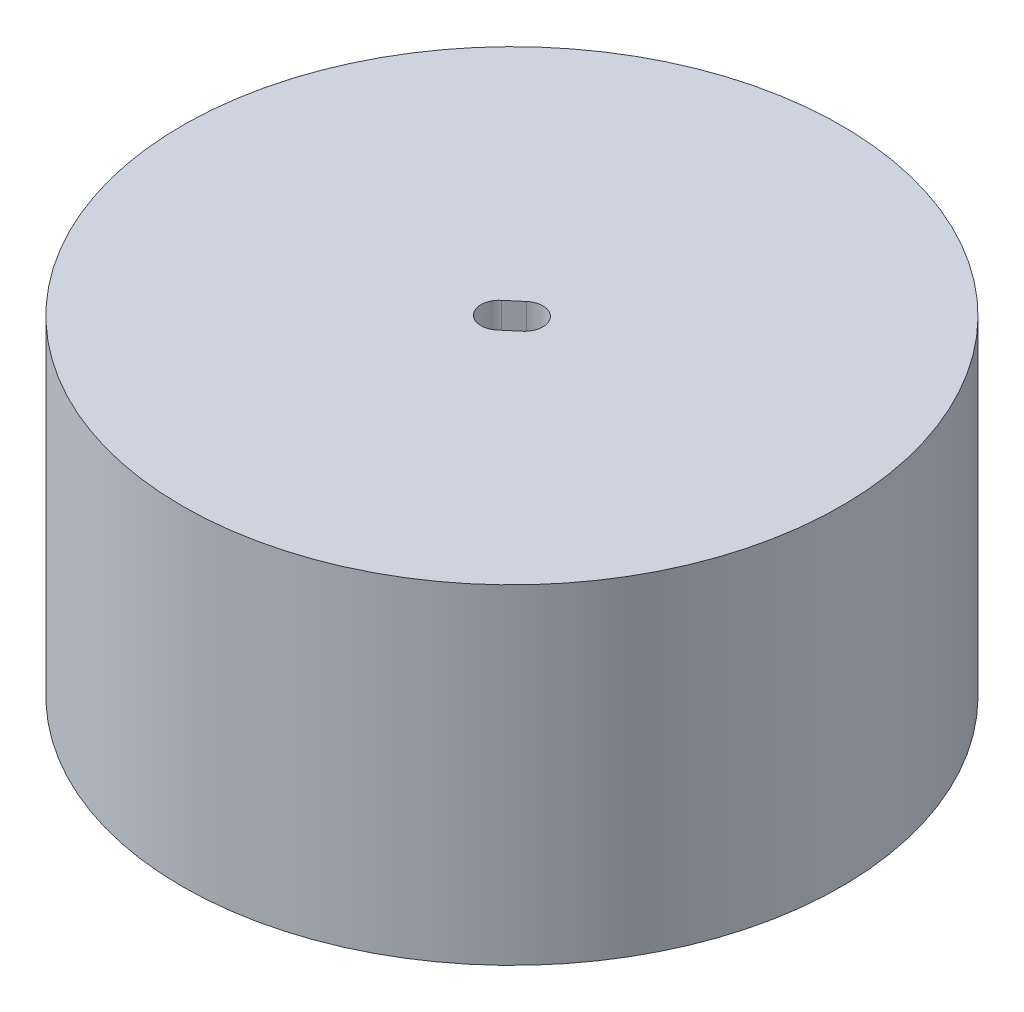
ISO-10303-21;
HEADER;
FILE_DESCRIPTION(('STEP AP214'),'2;1');
FILE_NAME('part.step','',(''),(''),'','','');
FILE_SCHEMA(('AUTOMOTIVE_DESIGN { 1 0 10303 214 1 1 1 1 }'));
ENDSEC;
DATA;
#1=APPLICATION_CONTEXT('core data for automotive mechanical design processes');
#2=APPLICATION_PROTOCOL_DEFINITION('international standard','automotive_design',2000,#1);
#3=PRODUCT_CONTEXT('',#1,'mechanical');
#4=PRODUCT('Part','Part','',(#3));
#5=PRODUCT_RELATED_PRODUCT_CATEGORY('part','',(#4));
#6=PRODUCT_DEFINITION_FORMATION('','',#4);
#7=PRODUCT_DEFINITION_CONTEXT('part definition',#1,'design');
#8=PRODUCT_DEFINITION('design','',#6,#7);
#9=PRODUCT_DEFINITION_SHAPE('','',#8);
#10=(LENGTH_UNIT() NAMED_UNIT(*) SI_UNIT(.MILLI.,.METRE.));
#11=(NAMED_UNIT(*) PLANE_ANGLE_UNIT() SI_UNIT($,.RADIAN.));
#12=(NAMED_UNIT(*) SI_UNIT($,.STERADIAN.) SOLID_ANGLE_UNIT());
#13=UNCERTAINTY_MEASURE_WITH_UNIT(LENGTH_MEASURE(1.E-05),#10,'distance_accuracy_value','');
#14=(GEOMETRIC_REPRESENTATION_CONTEXT(3) GLOBAL_UNCERTAINTY_ASSIGNED_CONTEXT((#13)) GLOBAL_UNIT_ASSIGNED_CONTEXT((#10,
#11,#12)) REPRESENTATION_CONTEXT('',''));
#15=CARTESIAN_POINT('',(0.,0.,0.));
#16=DIRECTION('',(0.,0.,1.));
#17=DIRECTION('',(1.,0.,0.));
#18=AXIS2_PLACEMENT_3D('',#15,#16,#17);
#19=CARTESIAN_POINT('',(0.,32.,0.));
#20=DIRECTION('',(0.,-1.,0.));
#21=DIRECTION('',(0.,0.,-1.));
#22=AXIS2_PLACEMENT_3D('',#19,#20,#21);
#23=CYLINDRICAL_SURFACE('',#22,32.);
#24=CARTESIAN_POINT('',(0.,32.,0.));
#25=DIRECTION('',(0.,1.,0.));
#26=DIRECTION('',(0.,0.,1.));
#27=AXIS2_PLACEMENT_3D('',#24,#25,#26);
#28=CIRCLE('',#27,32.);
#29=CARTESIAN_POINT('',(0.,32.,32.));
#30=VERTEX_POINT('',#29);
#31=EDGE_CURVE('E11',#30,#30,#28,.T.);
#32=ORIENTED_EDGE('',*,*,#31,.F.);
#33=EDGE_LOOP('',(#32));
#34=FACE_BOUND('',#33,.T.);
#35=CARTESIAN_POINT('',(0.,0.,0.));
#36=DIRECTION('',(0.,1.,0.));
#37=DIRECTION('',(0.,0.,1.));
#38=AXIS2_PLACEMENT_3D('',#35,#36,#37);
#39=CIRCLE('',#38,32.);
#40=CARTESIAN_POINT('',(0.,0.,32.));
#41=VERTEX_POINT('',#40);
#42=EDGE_CURVE('E36',#41,#41,#39,.T.);
#43=ORIENTED_EDGE('',*,*,#42,.T.);
#44=EDGE_LOOP('',(#43));
#45=FACE_BOUND('',#44,.T.);
#46=ADVANCED_FACE('F33',(#34,#45),#23,.T.);
#47=CARTESIAN_POINT('',(0.,32.,0.));
#48=DIRECTION('',(0.,1.,0.));
#49=DIRECTION('',(0.,0.,1.));
#50=AXIS2_PLACEMENT_3D('',#47,#48,#49);
#51=PLANE('',#50);
#52=CARTESIAN_POINT('',(-0.664144215849426,32.,0.561971939293905));
#53=DIRECTION('',(0.,1.,0.));
#54=DIRECTION('',(0.,0.,1.));
#55=AXIS2_PLACEMENT_3D('',#52,#53,#54);
#56=CIRCLE('',#55,1.775);
#57=CARTESIAN_POINT('',(-1.81069616096055,32.,-0.793034937870151));
#58=VERTEX_POINT('',#57);
#59=CARTESIAN_POINT('',(0.482407729261703,32.,1.91697881645796));
#60=VERTEX_POINT('',#59);
#61=EDGE_CURVE('E47',#58,#60,#56,.T.);
#62=ORIENTED_EDGE('',*,*,#61,.F.);
#63=DIRECTION('',(-0.763384156148764,0.,0.645944757809086));
#64=VECTOR('',#63,1.);
#65=CARTESIAN_POINT('',(-1.81069616096055,32.,-0.793034937870151));
#66=LINE('',#65,#64);
#67=CARTESIAN_POINT('',(-0.482407729261702,32.,-1.91697881645796));
#68=VERTEX_POINT('',#67);
#69=EDGE_CURVE('E91',#68,#58,#66,.T.);
#70=ORIENTED_EDGE('',*,*,#69,.F.);
#71=CARTESIAN_POINT('',(0.664144215849426,32.,-0.561971939293906));
#72=DIRECTION('',(0.,1.,0.));
#73=DIRECTION('',(0.,0.,1.));
#74=AXIS2_PLACEMENT_3D('',#71,#72,#73);
#75=CIRCLE('',#74,1.775);
#76=CARTESIAN_POINT('',(1.81069616096055,32.,0.793034937870151));
#77=VERTEX_POINT('',#76);
#78=EDGE_CURVE('E94',#77,#68,#75,.T.);
#79=ORIENTED_EDGE('',*,*,#78,.F.);
#80=DIRECTION('',(0.763384156148764,0.,-0.645944757809086));
#81=VECTOR('',#80,1.);
#82=CARTESIAN_POINT('',(0.482407729261703,32.,1.91697881645796));
#83=LINE('',#82,#81);
#84=EDGE_CURVE('E100',#60,#77,#83,.T.);
#85=ORIENTED_EDGE('',*,*,#84,.F.);
#86=EDGE_LOOP('',(#62,#70,#79,#85));
#87=FACE_BOUND('',#86,.T.);
#88=ORIENTED_EDGE('',*,*,#31,.T.);
#89=EDGE_LOOP('',(#88));
#90=FACE_BOUND('',#89,.T.);
#91=ADVANCED_FACE('F112',(#87,#90),#51,.T.);
#92=CARTESIAN_POINT('',(0.,0.,0.));
#93=DIRECTION('',(0.,1.,0.));
#94=DIRECTION('',(0.,0.,1.));
#95=AXIS2_PLACEMENT_3D('',#92,#93,#94);
#96=PLANE('',#95);
#97=DIRECTION('',(-0.763384156148764,0.,0.645944757809086));
#98=VECTOR('',#97,1.);
#99=CARTESIAN_POINT('',(-1.81069616096055,0.,-0.793034937870151));
#100=LINE('',#99,#98);
#101=CARTESIAN_POINT('',(-0.482407729261702,0.,-1.91697881645796));
#102=VERTEX_POINT('',#101);
#103=CARTESIAN_POINT('',(-1.81069616096055,0.,-0.793034937870151));
#104=VERTEX_POINT('',#103);
#105=EDGE_CURVE('E81',#102,#104,#100,.T.);
#106=ORIENTED_EDGE('',*,*,#105,.T.);
#107=CARTESIAN_POINT('',(-0.664144215849426,0.,0.561971939293905));
#108=DIRECTION('',(0.,1.,0.));
#109=DIRECTION('',(0.,0.,1.));
#110=AXIS2_PLACEMENT_3D('',#107,#108,#109);
#111=CIRCLE('',#110,1.775);
#112=CARTESIAN_POINT('',(0.482407729261703,0.,1.91697881645796));
#113=VERTEX_POINT('',#112);
#114=EDGE_CURVE('E75',#104,#113,#111,.T.);
#115=ORIENTED_EDGE('',*,*,#114,.T.);
#116=DIRECTION('',(0.763384156148764,0.,-0.645944757809086));
#117=VECTOR('',#116,1.);
#118=CARTESIAN_POINT('',(0.482407729261703,0.,1.91697881645796));
#119=LINE('',#118,#117);
#120=CARTESIAN_POINT('',(1.81069616096055,0.,0.793034937870152));
#121=VERTEX_POINT('',#120);
#122=EDGE_CURVE('E84',#113,#121,#119,.T.);
#123=ORIENTED_EDGE('',*,*,#122,.T.);
#124=CARTESIAN_POINT('',(0.664144215849426,0.,-0.561971939293906));
#125=DIRECTION('',(0.,1.,0.));
#126=DIRECTION('',(0.,0.,1.));
#127=AXIS2_PLACEMENT_3D('',#124,#125,#126);
#128=CIRCLE('',#127,1.775);
#129=EDGE_CURVE('E55',#121,#102,#128,.T.);
#130=ORIENTED_EDGE('',*,*,#129,.T.);
#131=EDGE_LOOP('',(#106,#115,#123,#130));
#132=FACE_BOUND('',#131,.T.);
#133=ORIENTED_EDGE('',*,*,#42,.F.);
#134=EDGE_LOOP('',(#133));
#135=FACE_BOUND('',#134,.T.);
#136=ADVANCED_FACE('F88',(#132,#135),#96,.F.);
#137=CARTESIAN_POINT('',(-0.664144215849426,0.,0.561971939293905));
#138=DIRECTION('',(0.,1.,0.));
#139=DIRECTION('',(0.,0.,1.));
#140=AXIS2_PLACEMENT_3D('',#137,#138,#139);
#141=CYLINDRICAL_SURFACE('',#140,1.775);
#142=ORIENTED_EDGE('',*,*,#61,.T.);
#143=DIRECTION('',(0.,1.,0.));
#144=VECTOR('',#143,1.);
#145=CARTESIAN_POINT('',(0.482407729261703,0.,1.91697881645796));
#146=LINE('',#145,#144);
#147=EDGE_CURVE('E71',#113,#60,#146,.T.);
#148=ORIENTED_EDGE('',*,*,#147,.F.);
#149=ORIENTED_EDGE('',*,*,#114,.F.);
#150=DIRECTION('',(0.,1.,0.));
#151=VECTOR('',#150,1.);
#152=CARTESIAN_POINT('',(-1.81069616096055,0.,-0.793034937870151));
#153=LINE('',#152,#151);
#154=EDGE_CURVE('E104',#104,#58,#153,.T.);
#155=ORIENTED_EDGE('',*,*,#154,.T.);
#156=EDGE_LOOP('',(#142,#148,#149,#155));
#157=FACE_BOUND('',#156,.T.);
#158=ADVANCED_FACE('F73',(#157),#141,.F.);
#159=CARTESIAN_POINT('',(-1.81069616096055,0.,-0.793034937870151));
#160=DIRECTION('',(-0.645944757809086,0.,-0.763384156148764));
#161=DIRECTION('',(-0.763384156148764,0.,0.645944757809086));
#162=AXIS2_PLACEMENT_3D('',#159,#160,#161);
#163=PLANE('',#162);
#164=ORIENTED_EDGE('',*,*,#69,.T.);
#165=ORIENTED_EDGE('',*,*,#154,.F.);
#166=ORIENTED_EDGE('',*,*,#105,.F.);
#167=DIRECTION('',(0.,1.,0.));
#168=VECTOR('',#167,1.);
#169=CARTESIAN_POINT('',(-0.482407729261702,0.,-1.91697881645796));
#170=LINE('',#169,#168);
#171=EDGE_CURVE('E106',#102,#68,#170,.T.);
#172=ORIENTED_EDGE('',*,*,#171,.T.);
#173=EDGE_LOOP('',(#164,#165,#166,#172));
#174=FACE_BOUND('',#173,.T.);
#175=ADVANCED_FACE('F115',(#174),#163,.F.);
#176=CARTESIAN_POINT('',(0.664144215849426,0.,-0.561971939293906));
#177=DIRECTION('',(0.,1.,0.));
#178=DIRECTION('',(0.,0.,1.));
#179=AXIS2_PLACEMENT_3D('',#176,#177,#178);
#180=CYLINDRICAL_SURFACE('',#179,1.775);
#181=ORIENTED_EDGE('',*,*,#78,.T.);
#182=ORIENTED_EDGE('',*,*,#171,.F.);
#183=ORIENTED_EDGE('',*,*,#129,.F.);
#184=DIRECTION('',(0.,1.,0.));
#185=VECTOR('',#184,1.);
#186=CARTESIAN_POINT('',(1.81069616096055,0.,0.793034937870151));
#187=LINE('',#186,#185);
#188=EDGE_CURVE('E80',#121,#77,#187,.T.);
#189=ORIENTED_EDGE('',*,*,#188,.T.);
#190=EDGE_LOOP('',(#181,#182,#183,#189));
#191=FACE_BOUND('',#190,.T.);
#192=ADVANCED_FACE('F108',(#191),#180,.F.);
#193=CARTESIAN_POINT('',(0.482407729261703,0.,1.91697881645796));
#194=DIRECTION('',(0.645944757809086,0.,0.763384156148764));
#195=DIRECTION('',(0.763384156148764,0.,-0.645944757809086));
#196=AXIS2_PLACEMENT_3D('',#193,#194,#195);
#197=PLANE('',#196);
#198=ORIENTED_EDGE('',*,*,#84,.T.);
#199=ORIENTED_EDGE('',*,*,#188,.F.);
#200=ORIENTED_EDGE('',*,*,#122,.F.);
#201=ORIENTED_EDGE('',*,*,#147,.T.);
#202=EDGE_LOOP('',(#198,#199,#200,#201));
#203=FACE_BOUND('',#202,.T.);
#204=ADVANCED_FACE('F85',(#203),#197,.F.);
#205=CLOSED_SHELL('',(#46,#91,#136,#158,#175,#192,#204));
#206=MANIFOLD_SOLID_BREP('B2',#205);
#207=ADVANCED_BREP_SHAPE_REPRESENTATION('',(#18,#206),#14);
#208=SHAPE_DEFINITION_REPRESENTATION(#9,#207);
ENDSEC;
END-ISO-10303-21;
